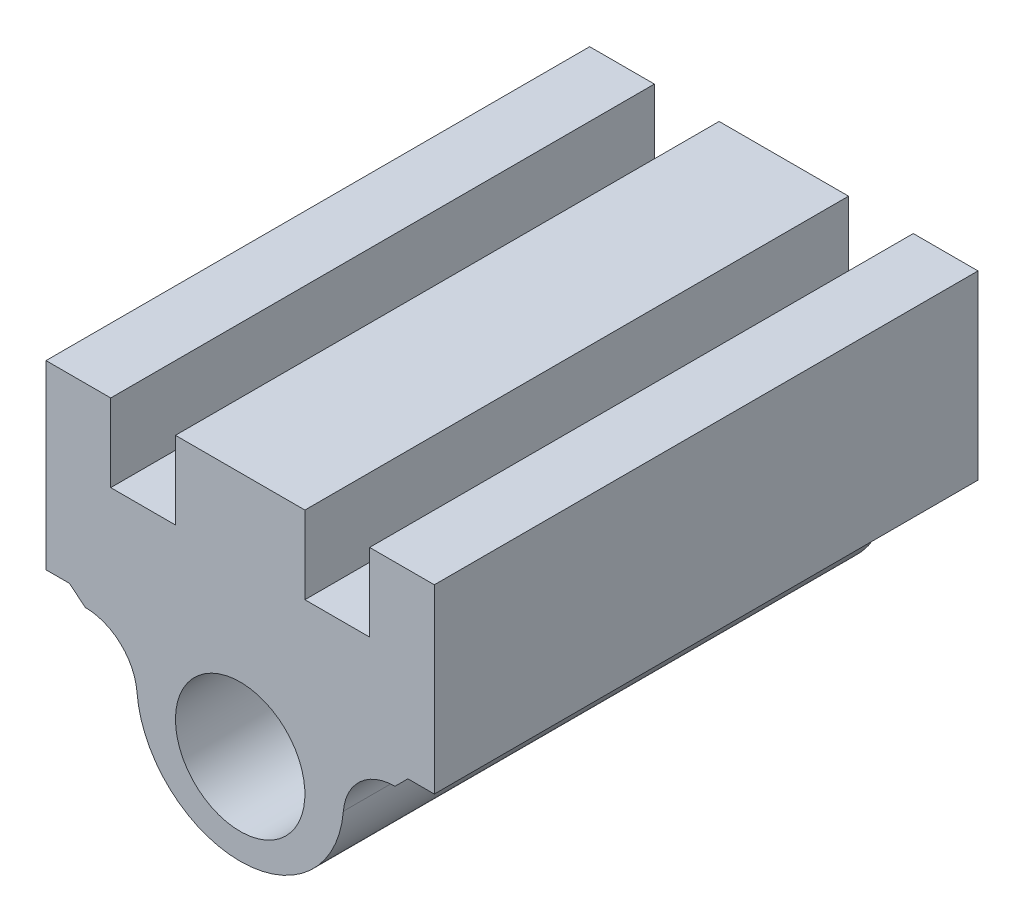
ISO-10303-21;
HEADER;
FILE_DESCRIPTION(('STEP AP214'),'2;1');
FILE_NAME('part.step','',(''),(''),'','','');
FILE_SCHEMA(('AUTOMOTIVE_DESIGN { 1 0 10303 214 1 1 1 1 }'));
ENDSEC;
DATA;
#1=APPLICATION_CONTEXT('core data for automotive mechanical design processes');
#2=APPLICATION_PROTOCOL_DEFINITION('international standard','automotive_design',2000,#1);
#3=PRODUCT_CONTEXT('',#1,'mechanical');
#4=PRODUCT('Part','Part','',(#3));
#5=PRODUCT_RELATED_PRODUCT_CATEGORY('part','',(#4));
#6=PRODUCT_DEFINITION_FORMATION('','',#4);
#7=PRODUCT_DEFINITION_CONTEXT('part definition',#1,'design');
#8=PRODUCT_DEFINITION('design','',#6,#7);
#9=PRODUCT_DEFINITION_SHAPE('','',#8);
#10=(LENGTH_UNIT() NAMED_UNIT(*) SI_UNIT(.MILLI.,.METRE.));
#11=(NAMED_UNIT(*) PLANE_ANGLE_UNIT() SI_UNIT($,.RADIAN.));
#12=(NAMED_UNIT(*) SI_UNIT($,.STERADIAN.) SOLID_ANGLE_UNIT());
#13=UNCERTAINTY_MEASURE_WITH_UNIT(LENGTH_MEASURE(1.E-05),#10,'distance_accuracy_value','');
#14=(GEOMETRIC_REPRESENTATION_CONTEXT(3) GLOBAL_UNCERTAINTY_ASSIGNED_CONTEXT((#13)) GLOBAL_UNIT_ASSIGNED_CONTEXT((#10,
#11,#12)) REPRESENTATION_CONTEXT('',''));
#15=CARTESIAN_POINT('',(0.,0.,0.));
#16=DIRECTION('',(0.,0.,1.));
#17=DIRECTION('',(1.,0.,0.));
#18=AXIS2_PLACEMENT_3D('',#15,#16,#17);
#19=CARTESIAN_POINT('',(0.,8.,0.));
#20=DIRECTION('',(0.,-1.,0.));
#21=DIRECTION('',(0.,0.,-1.));
#22=AXIS2_PLACEMENT_3D('',#19,#20,#21);
#23=PLANE('',#22);
#24=DIRECTION('',(0.,0.,-1.));
#25=VECTOR('',#24,1.);
#26=CARTESIAN_POINT('',(20.,8.,-42.));
#27=LINE('',#26,#25);
#28=CARTESIAN_POINT('',(20.,8.,0.));
#29=VERTEX_POINT('',#28);
#30=CARTESIAN_POINT('',(20.,8.,-42.));
#31=VERTEX_POINT('',#30);
#32=EDGE_CURVE('E53',#29,#31,#27,.T.);
#33=ORIENTED_EDGE('',*,*,#32,.F.);
#34=DIRECTION('',(1.,0.,0.));
#35=VECTOR('',#34,1.);
#36=CARTESIAN_POINT('',(0.,8.,0.));
#37=LINE('',#36,#35);
#38=CARTESIAN_POINT('',(25.,8.,0.));
#39=VERTEX_POINT('',#38);
#40=EDGE_CURVE('E195',#29,#39,#37,.T.);
#41=ORIENTED_EDGE('',*,*,#40,.T.);
#42=DIRECTION('',(0.,0.,1.));
#43=VECTOR('',#42,1.);
#44=CARTESIAN_POINT('',(25.,8.,-42.));
#45=LINE('',#44,#43);
#46=CARTESIAN_POINT('',(25.,8.,-42.));
#47=VERTEX_POINT('',#46);
#48=EDGE_CURVE('E291',#47,#39,#45,.T.);
#49=ORIENTED_EDGE('',*,*,#48,.F.);
#50=DIRECTION('',(-1.,0.,0.));
#51=VECTOR('',#50,1.);
#52=CARTESIAN_POINT('',(0.,8.,-42.));
#53=LINE('',#52,#51);
#54=EDGE_CURVE('E58',#47,#31,#53,.T.);
#55=ORIENTED_EDGE('',*,*,#54,.T.);
#56=EDGE_LOOP('',(#33,#41,#49,#55));
#57=FACE_BOUND('',#56,.T.);
#58=ADVANCED_FACE('F38',(#57),#23,.F.);
#59=DIRECTION('',(0.,0.,1.));
#60=VECTOR('',#59,1.);
#61=CARTESIAN_POINT('',(40.,8.,-42.));
#62=LINE('',#61,#60);
#63=CARTESIAN_POINT('',(40.,8.,-42.));
#64=VERTEX_POINT('',#63);
#65=CARTESIAN_POINT('',(40.,8.,0.));
#66=VERTEX_POINT('',#65);
#67=EDGE_CURVE('E231',#64,#66,#62,.T.);
#68=ORIENTED_EDGE('',*,*,#67,.F.);
#69=CARTESIAN_POINT('',(35.,8.,-42.));
#70=VERTEX_POINT('',#69);
#71=EDGE_CURVE('E46',#64,#70,#53,.T.);
#72=ORIENTED_EDGE('',*,*,#71,.T.);
#73=DIRECTION('',(0.,0.,-1.));
#74=VECTOR('',#73,1.);
#75=CARTESIAN_POINT('',(35.,8.,-42.));
#76=LINE('',#75,#74);
#77=CARTESIAN_POINT('',(35.,8.,0.));
#78=VERTEX_POINT('',#77);
#79=EDGE_CURVE('E298',#78,#70,#76,.T.);
#80=ORIENTED_EDGE('',*,*,#79,.F.);
#81=EDGE_CURVE('E191',#78,#66,#37,.T.);
#82=ORIENTED_EDGE('',*,*,#81,.T.);
#83=EDGE_LOOP('',(#68,#72,#80,#82));
#84=FACE_BOUND('',#83,.T.);
#85=ADVANCED_FACE('F317',(#84),#23,.F.);
#86=CARTESIAN_POINT('',(0.,0.,0.));
#87=DIRECTION('',(0.,-1.,0.));
#88=DIRECTION('',(0.,0.,-1.));
#89=AXIS2_PLACEMENT_3D('',#86,#87,#88);
#90=PLANE('',#89);
#91=DIRECTION('',(0.,0.,1.));
#92=VECTOR('',#91,1.);
#93=CARTESIAN_POINT('',(15.,0.,0.));
#94=LINE('',#93,#92);
#95=CARTESIAN_POINT('',(15.,0.,-42.));
#96=VERTEX_POINT('',#95);
#97=CARTESIAN_POINT('',(15.,0.,0.));
#98=VERTEX_POINT('',#97);
#99=EDGE_CURVE('E215',#96,#98,#94,.T.);
#100=ORIENTED_EDGE('',*,*,#99,.F.);
#101=DIRECTION('',(-1.,0.,0.));
#102=VECTOR('',#101,1.);
#103=CARTESIAN_POINT('',(0.,0.,-42.));
#104=LINE('',#103,#102);
#105=CARTESIAN_POINT('',(16.8030447960703,0.,-42.));
#106=VERTEX_POINT('',#105);
#107=EDGE_CURVE('E185',#106,#96,#104,.T.);
#108=ORIENTED_EDGE('',*,*,#107,.F.);
#109=DIRECTION('',(0.,0.,-1.));
#110=VECTOR('',#109,1.);
#111=CARTESIAN_POINT('',(16.8030447960703,0.,28.7766454131789));
#112=LINE('',#111,#110);
#113=CARTESIAN_POINT('',(16.8030447960703,0.,0.));
#114=VERTEX_POINT('',#113);
#115=EDGE_CURVE('E213',#114,#106,#112,.T.);
#116=ORIENTED_EDGE('',*,*,#115,.F.);
#117=DIRECTION('',(1.,0.,0.));
#118=VECTOR('',#117,1.);
#119=CARTESIAN_POINT('',(0.,0.,0.));
#120=LINE('',#119,#118);
#121=EDGE_CURVE('E182',#98,#114,#120,.T.);
#122=ORIENTED_EDGE('',*,*,#121,.F.);
#123=EDGE_LOOP('',(#100,#108,#116,#122));
#124=FACE_BOUND('',#123,.T.);
#125=ADVANCED_FACE('F211',(#124),#90,.T.);
#126=CARTESIAN_POINT('',(0.,8.,0.));
#127=DIRECTION('',(0.,0.,-1.));
#128=DIRECTION('',(-1.,0.,0.));
#129=AXIS2_PLACEMENT_3D('',#126,#127,#128);
#130=PLANE('',#129);
#131=CARTESIAN_POINT('',(42.9582607431014,0.,0.));
#132=VERTEX_POINT('',#131);
#133=CARTESIAN_POINT('',(45.,0.,0.));
#134=VERTEX_POINT('',#133);
#135=EDGE_CURVE('E176',#132,#134,#120,.T.);
#136=ORIENTED_EDGE('',*,*,#135,.T.);
#137=DIRECTION('',(0.,-1.,0.));
#138=VECTOR('',#137,1.);
#139=CARTESIAN_POINT('',(45.,14.,0.));
#140=LINE('',#139,#138);
#141=CARTESIAN_POINT('',(45.,14.,0.));
#142=VERTEX_POINT('',#141);
#143=EDGE_CURVE('E161',#142,#134,#140,.T.);
#144=ORIENTED_EDGE('',*,*,#143,.F.);
#145=DIRECTION('',(1.,0.,0.));
#146=VECTOR('',#145,1.);
#147=CARTESIAN_POINT('',(40.,14.,0.));
#148=LINE('',#147,#146);
#149=CARTESIAN_POINT('',(40.,14.,0.));
#150=VERTEX_POINT('',#149);
#151=EDGE_CURVE('E243',#150,#142,#148,.T.);
#152=ORIENTED_EDGE('',*,*,#151,.F.);
#153=DIRECTION('',(0.,-1.,0.));
#154=VECTOR('',#153,1.);
#155=CARTESIAN_POINT('',(40.,14.,0.));
#156=LINE('',#155,#154);
#157=EDGE_CURVE('E169',#150,#66,#156,.T.);
#158=ORIENTED_EDGE('',*,*,#157,.T.);
#159=ORIENTED_EDGE('',*,*,#81,.F.);
#160=DIRECTION('',(0.,-1.,0.));
#161=VECTOR('',#160,1.);
#162=CARTESIAN_POINT('',(35.,14.,0.));
#163=LINE('',#162,#161);
#164=CARTESIAN_POINT('',(35.,14.,0.));
#165=VERTEX_POINT('',#164);
#166=EDGE_CURVE('E187',#165,#78,#163,.T.);
#167=ORIENTED_EDGE('',*,*,#166,.F.);
#168=DIRECTION('',(1.,0.,0.));
#169=VECTOR('',#168,1.);
#170=CARTESIAN_POINT('',(25.,14.,0.));
#171=LINE('',#170,#169);
#172=CARTESIAN_POINT('',(25.,14.,0.));
#173=VERTEX_POINT('',#172);
#174=EDGE_CURVE('E297',#173,#165,#171,.T.);
#175=ORIENTED_EDGE('',*,*,#174,.F.);
#176=DIRECTION('',(0.,-1.,0.));
#177=VECTOR('',#176,1.);
#178=CARTESIAN_POINT('',(25.,14.,0.));
#179=LINE('',#178,#177);
#180=EDGE_CURVE('E183',#173,#39,#179,.T.);
#181=ORIENTED_EDGE('',*,*,#180,.T.);
#182=ORIENTED_EDGE('',*,*,#40,.F.);
#183=DIRECTION('',(0.,-1.,0.));
#184=VECTOR('',#183,1.);
#185=CARTESIAN_POINT('',(20.,14.,0.));
#186=LINE('',#185,#184);
#187=CARTESIAN_POINT('',(20.,14.,0.));
#188=VERTEX_POINT('',#187);
#189=EDGE_CURVE('E220',#188,#29,#186,.T.);
#190=ORIENTED_EDGE('',*,*,#189,.F.);
#191=DIRECTION('',(1.,0.,0.));
#192=VECTOR('',#191,1.);
#193=CARTESIAN_POINT('',(15.,14.,0.));
#194=LINE('',#193,#192);
#195=CARTESIAN_POINT('',(15.,14.,0.));
#196=VERTEX_POINT('',#195);
#197=EDGE_CURVE('E236',#196,#188,#194,.T.);
#198=ORIENTED_EDGE('',*,*,#197,.F.);
#199=DIRECTION('',(0.,-1.,0.));
#200=VECTOR('',#199,1.);
#201=CARTESIAN_POINT('',(15.,14.,0.));
#202=LINE('',#201,#200);
#203=EDGE_CURVE('E218',#196,#98,#202,.T.);
#204=ORIENTED_EDGE('',*,*,#203,.T.);
#205=ORIENTED_EDGE('',*,*,#121,.T.);
#206=DIRECTION('',(0.778089765424907,-0.628153099921519,0.));
#207=VECTOR('',#206,1.);
#208=CARTESIAN_POINT('',(18.0417392568986,-1.,0.));
#209=LINE('',#208,#207);
#210=CARTESIAN_POINT('',(18.0417392568986,-1.,0.));
#211=VERTEX_POINT('',#210);
#212=EDGE_CURVE('E264',#114,#211,#209,.T.);
#213=ORIENTED_EDGE('',*,*,#212,.T.);
#214=CARTESIAN_POINT('',(18.0417392568986,-5.,0.));
#215=DIRECTION('',(0.,0.,-1.));
#216=DIRECTION('',(-1.,0.,0.));
#217=AXIS2_PLACEMENT_3D('',#214,#215,#216);
#218=CIRCLE('',#217,4.);
#219=CARTESIAN_POINT('',(22.0278261712657,-4.66666666666667,0.));
#220=VERTEX_POINT('',#219);
#221=EDGE_CURVE('E262',#211,#220,#218,.T.);
#222=ORIENTED_EDGE('',*,*,#221,.T.);
#223=CARTESIAN_POINT('',(30.,-4.,0.));
#224=DIRECTION('',(0.,0.,-1.));
#225=DIRECTION('',(-1.,0.,0.));
#226=AXIS2_PLACEMENT_3D('',#223,#224,#225);
#227=CIRCLE('',#226,8.);
#228=CARTESIAN_POINT('',(37.9721738287343,-4.66666666666666,0.));
#229=VERTEX_POINT('',#228);
#230=EDGE_CURVE('E260',#220,#229,#227,.F.);
#231=ORIENTED_EDGE('',*,*,#230,.T.);
#232=CARTESIAN_POINT('',(41.9582607431014,-5.,0.));
#233=DIRECTION('',(0.,0.,-1.));
#234=DIRECTION('',(-1.,0.,0.));
#235=AXIS2_PLACEMENT_3D('',#232,#233,#234);
#236=CIRCLE('',#235,4.);
#237=CARTESIAN_POINT('',(41.9582607431014,-1.,0.));
#238=VERTEX_POINT('',#237);
#239=EDGE_CURVE('E258',#229,#238,#236,.T.);
#240=ORIENTED_EDGE('',*,*,#239,.T.);
#241=DIRECTION('',(0.70710678118655,0.707106781186545,0.));
#242=VECTOR('',#241,1.);
#243=CARTESIAN_POINT('',(41.9582607431014,-1.,0.));
#244=LINE('',#243,#242);
#245=EDGE_CURVE('E180',#238,#132,#244,.T.);
#246=ORIENTED_EDGE('',*,*,#245,.T.);
#247=EDGE_LOOP('',(#136,#144,#152,#158,#159,#167,#175,#181,#182,#190,#198,#204,#205,#213,#222,
#231,#240,#246));
#248=FACE_BOUND('',#247,.T.);
#249=CARTESIAN_POINT('',(30.,-5.,0.));
#250=DIRECTION('',(0.,0.,-1.));
#251=DIRECTION('',(-1.,0.,0.));
#252=AXIS2_PLACEMENT_3D('',#249,#250,#251);
#253=CIRCLE('',#252,5.);
#254=CARTESIAN_POINT('',(25.,-5.,0.));
#255=VERTEX_POINT('',#254);
#256=EDGE_CURVE('E288',#255,#255,#253,.T.);
#257=ORIENTED_EDGE('',*,*,#256,.T.);
#258=EDGE_LOOP('',(#257));
#259=FACE_BOUND('',#258,.T.);
#260=ADVANCED_FACE('F40',(#248,#259),#130,.F.);
#261=CARTESIAN_POINT('',(0.,8.,-42.));
#262=DIRECTION('',(0.,0.,1.));
#263=DIRECTION('',(1.,0.,0.));
#264=AXIS2_PLACEMENT_3D('',#261,#262,#263);
#265=PLANE('',#264);
#266=DIRECTION('',(0.,-1.,0.));
#267=VECTOR('',#266,1.);
#268=CARTESIAN_POINT('',(45.,14.,-42.));
#269=LINE('',#268,#267);
#270=CARTESIAN_POINT('',(45.,14.,-42.));
#271=VERTEX_POINT('',#270);
#272=CARTESIAN_POINT('',(45.,0.,-42.));
#273=VERTEX_POINT('',#272);
#274=EDGE_CURVE('E170',#271,#273,#269,.T.);
#275=ORIENTED_EDGE('',*,*,#274,.T.);
#276=CARTESIAN_POINT('',(42.9582607431014,0.,-42.));
#277=VERTEX_POINT('',#276);
#278=EDGE_CURVE('E177',#273,#277,#104,.T.);
#279=ORIENTED_EDGE('',*,*,#278,.T.);
#280=DIRECTION('',(-0.70710678118655,-0.707106781186545,0.));
#281=VECTOR('',#280,1.);
#282=CARTESIAN_POINT('',(41.9582607431014,-1.,-42.));
#283=LINE('',#282,#281);
#284=CARTESIAN_POINT('',(41.9582607431014,-1.,-42.));
#285=VERTEX_POINT('',#284);
#286=EDGE_CURVE('E256',#277,#285,#283,.T.);
#287=ORIENTED_EDGE('',*,*,#286,.T.);
#288=CARTESIAN_POINT('',(41.9582607431014,-5.,-42.));
#289=DIRECTION('',(0.,0.,1.));
#290=DIRECTION('',(-1.,0.,0.));
#291=AXIS2_PLACEMENT_3D('',#288,#289,#290);
#292=CIRCLE('',#291,4.);
#293=CARTESIAN_POINT('',(37.9721738287343,-4.66666666666666,-42.));
#294=VERTEX_POINT('',#293);
#295=EDGE_CURVE('E268',#285,#294,#292,.T.);
#296=ORIENTED_EDGE('',*,*,#295,.T.);
#297=CARTESIAN_POINT('',(30.,-4.,-42.));
#298=DIRECTION('',(0.,0.,-1.));
#299=DIRECTION('',(-1.,0.,0.));
#300=AXIS2_PLACEMENT_3D('',#297,#298,#299);
#301=CIRCLE('',#300,8.);
#302=CARTESIAN_POINT('',(22.0278261712657,-4.66666666666667,-42.));
#303=VERTEX_POINT('',#302);
#304=EDGE_CURVE('E271',#294,#303,#301,.T.);
#305=ORIENTED_EDGE('',*,*,#304,.T.);
#306=CARTESIAN_POINT('',(18.0417392568986,-5.,-42.));
#307=DIRECTION('',(0.,0.,1.));
#308=DIRECTION('',(-1.,0.,0.));
#309=AXIS2_PLACEMENT_3D('',#306,#307,#308);
#310=CIRCLE('',#309,4.);
#311=CARTESIAN_POINT('',(18.0417392568986,-1.,-42.));
#312=VERTEX_POINT('',#311);
#313=EDGE_CURVE('E274',#303,#312,#310,.T.);
#314=ORIENTED_EDGE('',*,*,#313,.T.);
#315=DIRECTION('',(-0.778089765424907,0.628153099921519,0.));
#316=VECTOR('',#315,1.);
#317=CARTESIAN_POINT('',(18.0417392568986,-1.,-42.));
#318=LINE('',#317,#316);
#319=EDGE_CURVE('E207',#312,#106,#318,.T.);
#320=ORIENTED_EDGE('',*,*,#319,.T.);
#321=ORIENTED_EDGE('',*,*,#107,.T.);
#322=DIRECTION('',(0.,-1.,0.));
#323=VECTOR('',#322,1.);
#324=CARTESIAN_POINT('',(15.,14.,-42.));
#325=LINE('',#324,#323);
#326=CARTESIAN_POINT('',(15.,14.,-42.));
#327=VERTEX_POINT('',#326);
#328=EDGE_CURVE('E203',#327,#96,#325,.T.);
#329=ORIENTED_EDGE('',*,*,#328,.F.);
#330=DIRECTION('',(-1.,0.,0.));
#331=VECTOR('',#330,1.);
#332=CARTESIAN_POINT('',(15.,14.,-42.));
#333=LINE('',#332,#331);
#334=CARTESIAN_POINT('',(20.,14.,-42.));
#335=VERTEX_POINT('',#334);
#336=EDGE_CURVE('E229',#335,#327,#333,.T.);
#337=ORIENTED_EDGE('',*,*,#336,.F.);
#338=DIRECTION('',(0.,-1.,0.));
#339=VECTOR('',#338,1.);
#340=CARTESIAN_POINT('',(20.,14.,-42.));
#341=LINE('',#340,#339);
#342=EDGE_CURVE('E225',#335,#31,#341,.T.);
#343=ORIENTED_EDGE('',*,*,#342,.T.);
#344=ORIENTED_EDGE('',*,*,#54,.F.);
#345=DIRECTION('',(0.,-1.,0.));
#346=VECTOR('',#345,1.);
#347=CARTESIAN_POINT('',(25.,14.,-42.));
#348=LINE('',#347,#346);
#349=CARTESIAN_POINT('',(25.,14.,-42.));
#350=VERTEX_POINT('',#349);
#351=EDGE_CURVE('E304',#350,#47,#348,.T.);
#352=ORIENTED_EDGE('',*,*,#351,.F.);
#353=DIRECTION('',(-1.,0.,0.));
#354=VECTOR('',#353,1.);
#355=CARTESIAN_POINT('',(25.,14.,-42.));
#356=LINE('',#355,#354);
#357=CARTESIAN_POINT('',(35.,14.,-42.));
#358=VERTEX_POINT('',#357);
#359=EDGE_CURVE('E302',#358,#350,#356,.T.);
#360=ORIENTED_EDGE('',*,*,#359,.F.);
#361=DIRECTION('',(0.,-1.,0.));
#362=VECTOR('',#361,1.);
#363=CARTESIAN_POINT('',(35.,14.,-42.));
#364=LINE('',#363,#362);
#365=EDGE_CURVE('E311',#358,#70,#364,.T.);
#366=ORIENTED_EDGE('',*,*,#365,.T.);
#367=ORIENTED_EDGE('',*,*,#71,.F.);
#368=DIRECTION('',(0.,-1.,0.));
#369=VECTOR('',#368,1.);
#370=CARTESIAN_POINT('',(40.,14.,-42.));
#371=LINE('',#370,#369);
#372=CARTESIAN_POINT('',(40.,14.,-42.));
#373=VERTEX_POINT('',#372);
#374=EDGE_CURVE('E248',#373,#64,#371,.T.);
#375=ORIENTED_EDGE('',*,*,#374,.F.);
#376=DIRECTION('',(-1.,0.,0.));
#377=VECTOR('',#376,1.);
#378=CARTESIAN_POINT('',(40.,14.,-42.));
#379=LINE('',#378,#377);
#380=EDGE_CURVE('E246',#271,#373,#379,.T.);
#381=ORIENTED_EDGE('',*,*,#380,.F.);
#382=EDGE_LOOP('',(#275,#279,#287,#296,#305,#314,#320,#321,#329,#337,#343,#344,#352,#360,#366,
#367,#375,#381));
#383=FACE_BOUND('',#382,.T.);
#384=CARTESIAN_POINT('',(30.,-5.,-42.));
#385=DIRECTION('',(0.,0.,-1.));
#386=DIRECTION('',(-1.,0.,0.));
#387=AXIS2_PLACEMENT_3D('',#384,#385,#386);
#388=CIRCLE('',#387,5.);
#389=CARTESIAN_POINT('',(25.,-5.,-42.));
#390=VERTEX_POINT('',#389);
#391=EDGE_CURVE('E266',#390,#390,#388,.T.);
#392=ORIENTED_EDGE('',*,*,#391,.F.);
#393=EDGE_LOOP('',(#392));
#394=FACE_BOUND('',#393,.T.);
#395=ADVANCED_FACE('F200',(#383,#394),#265,.F.);
#396=DIRECTION('',(0.,0.,-1.));
#397=VECTOR('',#396,1.);
#398=CARTESIAN_POINT('',(45.,0.,0.));
#399=LINE('',#398,#397);
#400=EDGE_CURVE('E11',#134,#273,#399,.T.);
#401=ORIENTED_EDGE('',*,*,#400,.F.);
#402=ORIENTED_EDGE('',*,*,#135,.F.);
#403=DIRECTION('',(0.,0.,-1.));
#404=VECTOR('',#403,1.);
#405=CARTESIAN_POINT('',(42.9582607431014,0.,28.7766454131789));
#406=LINE('',#405,#404);
#407=EDGE_CURVE('E277',#132,#277,#406,.T.);
#408=ORIENTED_EDGE('',*,*,#407,.T.);
#409=ORIENTED_EDGE('',*,*,#278,.F.);
#410=EDGE_LOOP('',(#401,#402,#408,#409));
#411=FACE_BOUND('',#410,.T.);
#412=ADVANCED_FACE('F174',(#411),#90,.T.);
#413=CARTESIAN_POINT('',(25.,14.,-42.));
#414=DIRECTION('',(1.,0.,0.));
#415=DIRECTION('',(0.,0.,-1.));
#416=AXIS2_PLACEMENT_3D('',#413,#414,#415);
#417=PLANE('',#416);
#418=ORIENTED_EDGE('',*,*,#48,.T.);
#419=ORIENTED_EDGE('',*,*,#180,.F.);
#420=DIRECTION('',(0.,0.,1.));
#421=VECTOR('',#420,1.);
#422=CARTESIAN_POINT('',(25.,14.,-42.));
#423=LINE('',#422,#421);
#424=EDGE_CURVE('E294',#350,#173,#423,.T.);
#425=ORIENTED_EDGE('',*,*,#424,.F.);
#426=ORIENTED_EDGE('',*,*,#351,.T.);
#427=EDGE_LOOP('',(#418,#419,#425,#426));
#428=FACE_BOUND('',#427,.T.);
#429=ADVANCED_FACE('F356',(#428),#417,.F.);
#430=CARTESIAN_POINT('',(35.,14.,-42.));
#431=DIRECTION('',(-1.,0.,0.));
#432=DIRECTION('',(0.,0.,1.));
#433=AXIS2_PLACEMENT_3D('',#430,#431,#432);
#434=PLANE('',#433);
#435=ORIENTED_EDGE('',*,*,#79,.T.);
#436=ORIENTED_EDGE('',*,*,#365,.F.);
#437=DIRECTION('',(0.,0.,-1.));
#438=VECTOR('',#437,1.);
#439=CARTESIAN_POINT('',(35.,14.,-42.));
#440=LINE('',#439,#438);
#441=EDGE_CURVE('E300',#165,#358,#440,.T.);
#442=ORIENTED_EDGE('',*,*,#441,.F.);
#443=ORIENTED_EDGE('',*,*,#166,.T.);
#444=EDGE_LOOP('',(#435,#436,#442,#443));
#445=FACE_BOUND('',#444,.T.);
#446=ADVANCED_FACE('F322',(#445),#434,.F.);
#447=CARTESIAN_POINT('',(0.,14.,0.));
#448=DIRECTION('',(0.,1.,0.));
#449=DIRECTION('',(0.,0.,1.));
#450=AXIS2_PLACEMENT_3D('',#447,#448,#449);
#451=PLANE('',#450);
#452=ORIENTED_EDGE('',*,*,#424,.T.);
#453=ORIENTED_EDGE('',*,*,#174,.T.);
#454=ORIENTED_EDGE('',*,*,#441,.T.);
#455=ORIENTED_EDGE('',*,*,#359,.T.);
#456=EDGE_LOOP('',(#452,#453,#454,#455));
#457=FACE_BOUND('',#456,.T.);
#458=ADVANCED_FACE('F329',(#457),#451,.T.);
#459=CARTESIAN_POINT('',(30.,-5.,0.));
#460=DIRECTION('',(0.,0.,-1.));
#461=DIRECTION('',(-1.,0.,0.));
#462=AXIS2_PLACEMENT_3D('',#459,#460,#461);
#463=CYLINDRICAL_SURFACE('',#462,5.);
#464=CARTESIAN_POINT('',(25.,-5.,0.));
#465=CARTESIAN_POINT('',(25.,-5.,-0.437499999999999));
#466=CARTESIAN_POINT('',(25.,-5.,-0.875));
#467=CARTESIAN_POINT('',(25.,-5.,-1.75));
#468=CARTESIAN_POINT('',(25.,-5.,-2.1875));
#469=CARTESIAN_POINT('',(25.,-5.,-3.0625));
#470=CARTESIAN_POINT('',(25.,-5.,-3.5));
#471=CARTESIAN_POINT('',(25.,-5.,-4.375));
#472=CARTESIAN_POINT('',(25.,-5.,-4.8125));
#473=CARTESIAN_POINT('',(25.,-5.,-5.6875));
#474=CARTESIAN_POINT('',(25.,-5.,-6.125));
#475=CARTESIAN_POINT('',(25.,-5.,-7.));
#476=CARTESIAN_POINT('',(25.,-5.,-7.4375));
#477=CARTESIAN_POINT('',(25.,-5.,-8.3125));
#478=CARTESIAN_POINT('',(25.,-5.,-8.75));
#479=CARTESIAN_POINT('',(25.,-5.,-9.625));
#480=CARTESIAN_POINT('',(25.,-5.,-10.0625));
#481=CARTESIAN_POINT('',(25.,-5.,-10.9375));
#482=CARTESIAN_POINT('',(25.,-5.,-11.375));
#483=CARTESIAN_POINT('',(25.,-5.,-12.25));
#484=CARTESIAN_POINT('',(25.,-5.,-12.6875));
#485=CARTESIAN_POINT('',(25.,-5.,-13.5625));
#486=CARTESIAN_POINT('',(25.,-5.,-14.));
#487=CARTESIAN_POINT('',(25.,-5.,-14.875));
#488=CARTESIAN_POINT('',(25.,-5.,-15.3125));
#489=CARTESIAN_POINT('',(25.,-5.,-16.1875));
#490=CARTESIAN_POINT('',(25.,-5.,-16.625));
#491=CARTESIAN_POINT('',(25.,-5.,-17.5));
#492=CARTESIAN_POINT('',(25.,-5.,-17.9375));
#493=CARTESIAN_POINT('',(25.,-5.,-18.8125));
#494=CARTESIAN_POINT('',(25.,-5.,-19.25));
#495=CARTESIAN_POINT('',(25.,-5.,-20.125));
#496=CARTESIAN_POINT('',(25.,-5.,-20.5625));
#497=CARTESIAN_POINT('',(25.,-5.,-21.4375));
#498=CARTESIAN_POINT('',(25.,-5.,-21.875));
#499=CARTESIAN_POINT('',(25.,-5.,-22.75));
#500=CARTESIAN_POINT('',(25.,-5.,-23.1875));
#501=CARTESIAN_POINT('',(25.,-5.,-24.0625));
#502=CARTESIAN_POINT('',(25.,-5.,-24.5));
#503=CARTESIAN_POINT('',(25.,-5.,-25.375));
#504=CARTESIAN_POINT('',(25.,-5.,-25.8125));
#505=CARTESIAN_POINT('',(25.,-5.,-26.6875));
#506=CARTESIAN_POINT('',(25.,-5.,-27.125));
#507=CARTESIAN_POINT('',(25.,-5.,-28.));
#508=CARTESIAN_POINT('',(25.,-5.,-28.4375));
#509=CARTESIAN_POINT('',(25.,-5.,-29.3125));
#510=CARTESIAN_POINT('',(25.,-5.,-29.75));
#511=CARTESIAN_POINT('',(25.,-5.,-30.625));
#512=CARTESIAN_POINT('',(25.,-5.,-31.0625));
#513=CARTESIAN_POINT('',(25.,-5.,-31.9375));
#514=CARTESIAN_POINT('',(25.,-5.,-32.375));
#515=CARTESIAN_POINT('',(25.,-5.,-33.25));
#516=CARTESIAN_POINT('',(25.,-5.,-33.6875));
#517=CARTESIAN_POINT('',(25.,-5.,-34.5625));
#518=CARTESIAN_POINT('',(25.,-5.,-35.));
#519=CARTESIAN_POINT('',(25.,-5.,-35.875));
#520=CARTESIAN_POINT('',(25.,-5.,-36.3125));
#521=CARTESIAN_POINT('',(25.,-5.,-37.1875));
#522=CARTESIAN_POINT('',(25.,-5.,-37.625));
#523=CARTESIAN_POINT('',(25.,-5.,-38.5));
#524=CARTESIAN_POINT('',(25.,-5.,-38.9375));
#525=CARTESIAN_POINT('',(25.,-5.,-39.8125));
#526=CARTESIAN_POINT('',(25.,-5.,-40.25));
#527=CARTESIAN_POINT('',(25.,-5.,-41.125));
#528=CARTESIAN_POINT('',(25.,-5.,-41.5625));
#529=CARTESIAN_POINT('',(25.,-5.,-42.));
#530=B_SPLINE_CURVE_WITH_KNOTS('',3,(#464,#465,#466,#467,#468,#469,#470,#471,#472,#473,#474,
#475,#476,#477,#478,#479,#480,#481,#482,#483,#484,#485,#486,#487,#488,#489,#490,#491,#492,#493,
#494,#495,#496,#497,#498,#499,#500,#501,#502,#503,#504,#505,#506,#507,#508,#509,#510,#511,#512,
#513,#514,#515,#516,#517,#518,#519,#520,#521,#522,#523,#524,#525,#526,#527,#528,#529),
.UNSPECIFIED.,.F.,.F.,(4,2,2,2,2,2,2,2,2,2,2,2,2,2,2,2,2,2,2,2,2,2,2,2,2,2,2,2,2,2,2,2,4),(0.,
1.3125,2.625,3.9375,5.25,6.5625,7.875,9.1875,10.5,11.8125,13.125,14.4375,15.75,17.0625,18.375,
19.6875,21.,22.3125,23.625,24.9375,26.25,27.5625,28.875,30.1875,31.5,32.8125,34.125,35.4375,
36.75,38.0625,39.375,40.6875,42.),.UNSPECIFIED.);
#531=EDGE_CURVE('BSEAM492',#255,#390,#530,.T.);
#532=ORIENTED_EDGE('',*,*,#256,.F.);
#533=ORIENTED_EDGE('',*,*,#391,.T.);
#534=ORIENTED_EDGE('',*,*,#531,.T.);
#535=ORIENTED_EDGE('',*,*,#531,.F.);
#536=EDGE_LOOP('',(#532,#534,#533,#535));
#537=FACE_BOUND('',#536,.T.);
#538=ADVANCED_FACE('F492',(#537),#463,.F.);
#539=CARTESIAN_POINT('',(18.0417392568986,-1.,28.7766454131789));
#540=DIRECTION('',(-0.628153099921519,-0.778089765424907,0.));
#541=DIRECTION('',(0.778089765424907,-0.628153099921519,0.));
#542=AXIS2_PLACEMENT_3D('',#539,#540,#541);
#543=PLANE('',#542);
#544=ORIENTED_EDGE('',*,*,#212,.F.);
#545=ORIENTED_EDGE('',*,*,#115,.T.);
#546=ORIENTED_EDGE('',*,*,#319,.F.);
#547=DIRECTION('',(0.,0.,-1.));
#548=VECTOR('',#547,1.);
#549=CARTESIAN_POINT('',(18.0417392568986,-1.,28.7766454131789));
#550=LINE('',#549,#548);
#551=EDGE_CURVE('E279',#211,#312,#550,.T.);
#552=ORIENTED_EDGE('',*,*,#551,.F.);
#553=EDGE_LOOP('',(#544,#545,#546,#552));
#554=FACE_BOUND('',#553,.T.);
#555=ADVANCED_FACE('F482',(#554),#543,.T.);
#556=CARTESIAN_POINT('',(18.0417392568986,-5.,28.7766454131789));
#557=DIRECTION('',(0.,0.,-1.));
#558=DIRECTION('',(-1.,0.,0.));
#559=AXIS2_PLACEMENT_3D('',#556,#557,#558);
#560=CYLINDRICAL_SURFACE('',#559,4.);
#561=ORIENTED_EDGE('',*,*,#221,.F.);
#562=ORIENTED_EDGE('',*,*,#551,.T.);
#563=ORIENTED_EDGE('',*,*,#313,.F.);
#564=DIRECTION('',(0.,0.,-1.));
#565=VECTOR('',#564,1.);
#566=CARTESIAN_POINT('',(22.0278261712657,-4.66666666666667,28.7766454131789));
#567=LINE('',#566,#565);
#568=EDGE_CURVE('E281',#220,#303,#567,.T.);
#569=ORIENTED_EDGE('',*,*,#568,.F.);
#570=EDGE_LOOP('',(#561,#562,#563,#569));
#571=FACE_BOUND('',#570,.T.);
#572=ADVANCED_FACE('F473',(#571),#560,.F.);
#573=CARTESIAN_POINT('',(30.,-4.,28.7766454131789));
#574=DIRECTION('',(0.,0.,-1.));
#575=DIRECTION('',(-1.,0.,0.));
#576=AXIS2_PLACEMENT_3D('',#573,#574,#575);
#577=CYLINDRICAL_SURFACE('',#576,8.);
#578=ORIENTED_EDGE('',*,*,#230,.F.);
#579=ORIENTED_EDGE('',*,*,#568,.T.);
#580=ORIENTED_EDGE('',*,*,#304,.F.);
#581=DIRECTION('',(0.,0.,-1.));
#582=VECTOR('',#581,1.);
#583=CARTESIAN_POINT('',(37.9721738287343,-4.66666666666666,28.7766454131789));
#584=LINE('',#583,#582);
#585=EDGE_CURVE('E283',#229,#294,#584,.T.);
#586=ORIENTED_EDGE('',*,*,#585,.F.);
#587=EDGE_LOOP('',(#578,#579,#580,#586));
#588=FACE_BOUND('',#587,.T.);
#589=ADVANCED_FACE('F462',(#588),#577,.T.);
#590=CARTESIAN_POINT('',(41.9582607431014,-5.,28.7766454131789));
#591=DIRECTION('',(0.,0.,-1.));
#592=DIRECTION('',(-1.,0.,0.));
#593=AXIS2_PLACEMENT_3D('',#590,#591,#592);
#594=CYLINDRICAL_SURFACE('',#593,4.);
#595=ORIENTED_EDGE('',*,*,#239,.F.);
#596=ORIENTED_EDGE('',*,*,#585,.T.);
#597=ORIENTED_EDGE('',*,*,#295,.F.);
#598=DIRECTION('',(0.,0.,-1.));
#599=VECTOR('',#598,1.);
#600=CARTESIAN_POINT('',(41.9582607431014,-1.,28.7766454131789));
#601=LINE('',#600,#599);
#602=EDGE_CURVE('E285',#238,#285,#601,.T.);
#603=ORIENTED_EDGE('',*,*,#602,.F.);
#604=EDGE_LOOP('',(#595,#596,#597,#603));
#605=FACE_BOUND('',#604,.T.);
#606=ADVANCED_FACE('F453',(#605),#594,.F.);
#607=CARTESIAN_POINT('',(41.9582607431014,-1.,28.7766454131789));
#608=DIRECTION('',(0.707106781186545,-0.70710678118655,0.));
#609=DIRECTION('',(0.70710678118655,0.707106781186545,0.));
#610=AXIS2_PLACEMENT_3D('',#607,#608,#609);
#611=PLANE('',#610);
#612=ORIENTED_EDGE('',*,*,#245,.F.);
#613=ORIENTED_EDGE('',*,*,#602,.T.);
#614=ORIENTED_EDGE('',*,*,#286,.F.);
#615=ORIENTED_EDGE('',*,*,#407,.F.);
#616=EDGE_LOOP('',(#612,#613,#614,#615));
#617=FACE_BOUND('',#616,.T.);
#618=ADVANCED_FACE('F386',(#617),#611,.T.);
#619=CARTESIAN_POINT('',(40.,14.,-42.));
#620=DIRECTION('',(1.,0.,0.));
#621=DIRECTION('',(0.,0.,-1.));
#622=AXIS2_PLACEMENT_3D('',#619,#620,#621);
#623=PLANE('',#622);
#624=ORIENTED_EDGE('',*,*,#67,.T.);
#625=ORIENTED_EDGE('',*,*,#157,.F.);
#626=DIRECTION('',(0.,0.,1.));
#627=VECTOR('',#626,1.);
#628=CARTESIAN_POINT('',(40.,14.,-42.));
#629=LINE('',#628,#627);
#630=EDGE_CURVE('E240',#373,#150,#629,.T.);
#631=ORIENTED_EDGE('',*,*,#630,.F.);
#632=ORIENTED_EDGE('',*,*,#374,.T.);
#633=EDGE_LOOP('',(#624,#625,#631,#632));
#634=FACE_BOUND('',#633,.T.);
#635=ADVANCED_FACE('F334',(#634),#623,.F.);
#636=CARTESIAN_POINT('',(45.,14.,-42.));
#637=DIRECTION('',(-1.,0.,0.));
#638=DIRECTION('',(0.,0.,1.));
#639=AXIS2_PLACEMENT_3D('',#636,#637,#638);
#640=PLANE('',#639);
#641=ORIENTED_EDGE('',*,*,#143,.T.);
#642=ORIENTED_EDGE('',*,*,#400,.T.);
#643=ORIENTED_EDGE('',*,*,#274,.F.);
#644=DIRECTION('',(0.,0.,-1.));
#645=VECTOR('',#644,1.);
#646=CARTESIAN_POINT('',(45.,14.,-42.));
#647=LINE('',#646,#645);
#648=EDGE_CURVE('E166',#142,#271,#647,.T.);
#649=ORIENTED_EDGE('',*,*,#648,.F.);
#650=EDGE_LOOP('',(#641,#642,#643,#649));
#651=FACE_BOUND('',#650,.T.);
#652=ADVANCED_FACE('F163',(#651),#640,.F.);
#653=CARTESIAN_POINT('',(0.,14.,0.));
#654=DIRECTION('',(0.,1.,0.));
#655=DIRECTION('',(0.,0.,1.));
#656=AXIS2_PLACEMENT_3D('',#653,#654,#655);
#657=PLANE('',#656);
#658=ORIENTED_EDGE('',*,*,#630,.T.);
#659=ORIENTED_EDGE('',*,*,#151,.T.);
#660=ORIENTED_EDGE('',*,*,#648,.T.);
#661=ORIENTED_EDGE('',*,*,#380,.T.);
#662=EDGE_LOOP('',(#658,#659,#660,#661));
#663=FACE_BOUND('',#662,.T.);
#664=ADVANCED_FACE('F337',(#663),#657,.T.);
#665=CARTESIAN_POINT('',(15.,14.,-42.));
#666=DIRECTION('',(1.,0.,0.));
#667=DIRECTION('',(0.,0.,-1.));
#668=AXIS2_PLACEMENT_3D('',#665,#666,#667);
#669=PLANE('',#668);
#670=ORIENTED_EDGE('',*,*,#328,.T.);
#671=ORIENTED_EDGE('',*,*,#99,.T.);
#672=ORIENTED_EDGE('',*,*,#203,.F.);
#673=DIRECTION('',(0.,0.,1.));
#674=VECTOR('',#673,1.);
#675=CARTESIAN_POINT('',(15.,14.,-42.));
#676=LINE('',#675,#674);
#677=EDGE_CURVE('E232',#327,#196,#676,.T.);
#678=ORIENTED_EDGE('',*,*,#677,.F.);
#679=EDGE_LOOP('',(#670,#671,#672,#678));
#680=FACE_BOUND('',#679,.T.);
#681=ADVANCED_FACE('F339',(#680),#669,.F.);
#682=CARTESIAN_POINT('',(20.,14.,-42.));
#683=DIRECTION('',(-1.,0.,0.));
#684=DIRECTION('',(0.,0.,1.));
#685=AXIS2_PLACEMENT_3D('',#682,#683,#684);
#686=PLANE('',#685);
#687=ORIENTED_EDGE('',*,*,#32,.T.);
#688=ORIENTED_EDGE('',*,*,#342,.F.);
#689=DIRECTION('',(0.,0.,-1.));
#690=VECTOR('',#689,1.);
#691=CARTESIAN_POINT('',(20.,14.,-42.));
#692=LINE('',#691,#690);
#693=EDGE_CURVE('E234',#188,#335,#692,.T.);
#694=ORIENTED_EDGE('',*,*,#693,.F.);
#695=ORIENTED_EDGE('',*,*,#189,.T.);
#696=EDGE_LOOP('',(#687,#688,#694,#695));
#697=FACE_BOUND('',#696,.T.);
#698=ADVANCED_FACE('F345',(#697),#686,.F.);
#699=CARTESIAN_POINT('',(0.,14.,0.));
#700=DIRECTION('',(0.,1.,0.));
#701=DIRECTION('',(0.,0.,1.));
#702=AXIS2_PLACEMENT_3D('',#699,#700,#701);
#703=PLANE('',#702);
#704=ORIENTED_EDGE('',*,*,#677,.T.);
#705=ORIENTED_EDGE('',*,*,#197,.T.);
#706=ORIENTED_EDGE('',*,*,#693,.T.);
#707=ORIENTED_EDGE('',*,*,#336,.T.);
#708=EDGE_LOOP('',(#704,#705,#706,#707));
#709=FACE_BOUND('',#708,.T.);
#710=ADVANCED_FACE('F405',(#709),#703,.T.);
#711=CLOSED_SHELL('',(#58,#85,#125,#260,#395,#412,#429,#446,#458,#538,#555,#572,#589,#606,#618,
#635,#652,#664,#681,#698,#710));
#712=MANIFOLD_SOLID_BREP('B2',#711);
#713=ADVANCED_BREP_SHAPE_REPRESENTATION('',(#18,#712),#14);
#714=SHAPE_DEFINITION_REPRESENTATION(#9,#713);
ENDSEC;
END-ISO-10303-21;
